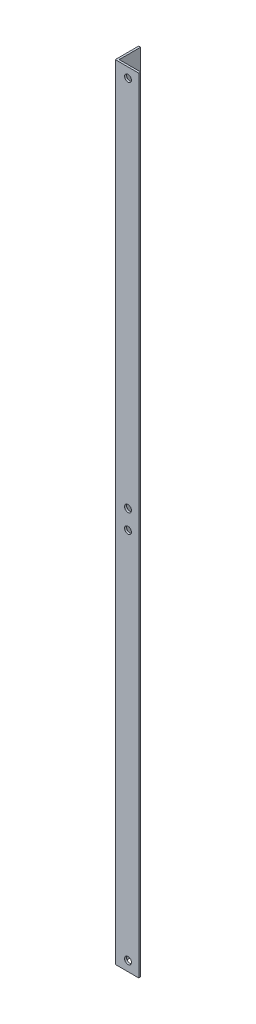
ISO-10303-21;
HEADER;
FILE_DESCRIPTION(('STEP AP214'),'2;1');
FILE_NAME('part.step','',(''),(''),'','','');
FILE_SCHEMA(('AUTOMOTIVE_DESIGN { 1 0 10303 214 1 1 1 1 }'));
ENDSEC;
DATA;
#1=APPLICATION_CONTEXT('core data for automotive mechanical design processes');
#2=APPLICATION_PROTOCOL_DEFINITION('international standard','automotive_design',2000,#1);
#3=PRODUCT_CONTEXT('',#1,'mechanical');
#4=PRODUCT('Part','Part','',(#3));
#5=PRODUCT_RELATED_PRODUCT_CATEGORY('part','',(#4));
#6=PRODUCT_DEFINITION_FORMATION('','',#4);
#7=PRODUCT_DEFINITION_CONTEXT('part definition',#1,'design');
#8=PRODUCT_DEFINITION('design','',#6,#7);
#9=PRODUCT_DEFINITION_SHAPE('','',#8);
#10=(LENGTH_UNIT() NAMED_UNIT(*) SI_UNIT(.MILLI.,.METRE.));
#11=(NAMED_UNIT(*) PLANE_ANGLE_UNIT() SI_UNIT($,.RADIAN.));
#12=(NAMED_UNIT(*) SI_UNIT($,.STERADIAN.) SOLID_ANGLE_UNIT());
#13=UNCERTAINTY_MEASURE_WITH_UNIT(LENGTH_MEASURE(1.E-05),#10,'distance_accuracy_value','');
#14=(GEOMETRIC_REPRESENTATION_CONTEXT(3) GLOBAL_UNCERTAINTY_ASSIGNED_CONTEXT((#13)) GLOBAL_UNIT_ASSIGNED_CONTEXT((#10,
#11,#12)) REPRESENTATION_CONTEXT('',''));
#15=CARTESIAN_POINT('',(0.,0.,0.));
#16=DIRECTION('',(0.,0.,1.));
#17=DIRECTION('',(1.,0.,0.));
#18=AXIS2_PLACEMENT_3D('',#15,#16,#17);
#19=CARTESIAN_POINT('',(0.,635.,0.));
#20=DIRECTION('',(1.,0.,0.));
#21=DIRECTION('',(0.,0.,-1.));
#22=AXIS2_PLACEMENT_3D('',#19,#20,#21);
#23=PLANE('',#22);
#24=DIRECTION('',(0.,0.,1.));
#25=VECTOR('',#24,1.);
#26=CARTESIAN_POINT('',(0.,-635.,0.));
#27=LINE('',#26,#25);
#28=CARTESIAN_POINT('',(0.,-635.,-38.1));
#29=VERTEX_POINT('',#28);
#30=CARTESIAN_POINT('',(0.,-635.,0.));
#31=VERTEX_POINT('',#30);
#32=EDGE_CURVE('E117',#29,#31,#27,.T.);
#33=ORIENTED_EDGE('',*,*,#32,.T.);
#34=DIRECTION('',(0.,-1.,0.));
#35=VECTOR('',#34,1.);
#36=CARTESIAN_POINT('',(0.,635.,0.));
#37=LINE('',#36,#35);
#38=CARTESIAN_POINT('',(0.,635.,0.));
#39=VERTEX_POINT('',#38);
#40=EDGE_CURVE('E11',#39,#31,#37,.T.);
#41=ORIENTED_EDGE('',*,*,#40,.F.);
#42=DIRECTION('',(0.,0.,1.));
#43=VECTOR('',#42,1.);
#44=CARTESIAN_POINT('',(0.,635.,0.));
#45=LINE('',#44,#43);
#46=CARTESIAN_POINT('',(0.,635.,-38.1));
#47=VERTEX_POINT('',#46);
#48=EDGE_CURVE('E128',#47,#39,#45,.T.);
#49=ORIENTED_EDGE('',*,*,#48,.F.);
#50=DIRECTION('',(0.,-1.,0.));
#51=VECTOR('',#50,1.);
#52=CARTESIAN_POINT('',(0.,635.,-38.1));
#53=LINE('',#52,#51);
#54=EDGE_CURVE('E113',#47,#29,#53,.T.);
#55=ORIENTED_EDGE('',*,*,#54,.T.);
#56=EDGE_LOOP('',(#33,#41,#49,#55));
#57=FACE_BOUND('',#56,.T.);
#58=ADVANCED_FACE('F33',(#57),#23,.F.);
#59=CARTESIAN_POINT('',(0.,635.,0.));
#60=DIRECTION('',(0.,0.,-1.));
#61=DIRECTION('',(-1.,0.,0.));
#62=AXIS2_PLACEMENT_3D('',#59,#60,#61);
#63=PLANE('',#62);
#64=CARTESIAN_POINT('',(20.6375,-619.125,0.));
#65=DIRECTION('',(0.,0.,1.));
#66=DIRECTION('',(-1.,0.,0.));
#67=AXIS2_PLACEMENT_3D('',#64,#65,#66);
#68=CIRCLE('',#67,5.58799999999991);
#69=CARTESIAN_POINT('',(15.0495000000001,-619.125,0.));
#70=VERTEX_POINT('',#69);
#71=EDGE_CURVE('E185',#70,#70,#68,.T.);
#72=ORIENTED_EDGE('',*,*,#71,.F.);
#73=EDGE_LOOP('',(#72));
#74=FACE_BOUND('',#73,.T.);
#75=CARTESIAN_POINT('',(20.6375,-15.24,0.));
#76=DIRECTION('',(0.,0.,1.));
#77=DIRECTION('',(-1.,0.,0.));
#78=AXIS2_PLACEMENT_3D('',#75,#76,#77);
#79=CIRCLE('',#78,5.58799999999994);
#80=CARTESIAN_POINT('',(15.0495000000001,-15.24,0.));
#81=VERTEX_POINT('',#80);
#82=EDGE_CURVE('E198',#81,#81,#79,.T.);
#83=ORIENTED_EDGE('',*,*,#82,.F.);
#84=EDGE_LOOP('',(#83));
#85=FACE_BOUND('',#84,.T.);
#86=CARTESIAN_POINT('',(20.6375,619.125,0.));
#87=DIRECTION('',(0.,0.,-1.));
#88=DIRECTION('',(-1.,0.,0.));
#89=AXIS2_PLACEMENT_3D('',#86,#87,#88);
#90=CIRCLE('',#89,5.58799999999991);
#91=CARTESIAN_POINT('',(15.0495000000001,619.125,0.));
#92=VERTEX_POINT('',#91);
#93=EDGE_CURVE('E121',#92,#92,#90,.T.);
#94=ORIENTED_EDGE('',*,*,#93,.T.);
#95=EDGE_LOOP('',(#94));
#96=FACE_BOUND('',#95,.T.);
#97=CARTESIAN_POINT('',(20.6375,15.24,0.));
#98=DIRECTION('',(0.,0.,-1.));
#99=DIRECTION('',(-1.,0.,0.));
#100=AXIS2_PLACEMENT_3D('',#97,#98,#99);
#101=CIRCLE('',#100,5.58799999999994);
#102=CARTESIAN_POINT('',(15.0495000000001,15.24,0.));
#103=VERTEX_POINT('',#102);
#104=EDGE_CURVE('E184',#103,#103,#101,.T.);
#105=ORIENTED_EDGE('',*,*,#104,.T.);
#106=EDGE_LOOP('',(#105));
#107=FACE_BOUND('',#106,.T.);
#108=DIRECTION('',(1.,0.,0.));
#109=VECTOR('',#108,1.);
#110=CARTESIAN_POINT('',(0.,-635.,0.));
#111=LINE('',#110,#109);
#112=CARTESIAN_POINT('',(38.1,-635.,0.));
#113=VERTEX_POINT('',#112);
#114=EDGE_CURVE('E120',#31,#113,#111,.T.);
#115=ORIENTED_EDGE('',*,*,#114,.T.);
#116=DIRECTION('',(0.,-1.,0.));
#117=VECTOR('',#116,1.);
#118=CARTESIAN_POINT('',(38.1,635.,0.));
#119=LINE('',#118,#117);
#120=CARTESIAN_POINT('',(38.1,635.,0.));
#121=VERTEX_POINT('',#120);
#122=EDGE_CURVE('E41',#121,#113,#119,.T.);
#123=ORIENTED_EDGE('',*,*,#122,.F.);
#124=DIRECTION('',(1.,0.,0.));
#125=VECTOR('',#124,1.);
#126=CARTESIAN_POINT('',(0.,635.,0.));
#127=LINE('',#126,#125);
#128=EDGE_CURVE('E86',#39,#121,#127,.T.);
#129=ORIENTED_EDGE('',*,*,#128,.F.);
#130=ORIENTED_EDGE('',*,*,#40,.T.);
#131=EDGE_LOOP('',(#115,#123,#129,#130));
#132=FACE_BOUND('',#131,.T.);
#133=ADVANCED_FACE('F152',(#74,#85,#96,#107,#132),#63,.F.);
#134=CARTESIAN_POINT('',(38.1,635.,0.));
#135=DIRECTION('',(-1.,0.,0.));
#136=DIRECTION('',(0.,0.,1.));
#137=AXIS2_PLACEMENT_3D('',#134,#135,#136);
#138=PLANE('',#137);
#139=DIRECTION('',(0.,0.,-1.));
#140=VECTOR('',#139,1.);
#141=CARTESIAN_POINT('',(38.1,-635.,0.));
#142=LINE('',#141,#140);
#143=CARTESIAN_POINT('',(38.1,-635.,-3.175));
#144=VERTEX_POINT('',#143);
#145=EDGE_CURVE('E123',#113,#144,#142,.T.);
#146=ORIENTED_EDGE('',*,*,#145,.T.);
#147=DIRECTION('',(0.,-1.,0.));
#148=VECTOR('',#147,1.);
#149=CARTESIAN_POINT('',(38.1,635.,-3.175));
#150=LINE('',#149,#148);
#151=CARTESIAN_POINT('',(38.1,635.,-3.175));
#152=VERTEX_POINT('',#151);
#153=EDGE_CURVE('E108',#152,#144,#150,.T.);
#154=ORIENTED_EDGE('',*,*,#153,.F.);
#155=DIRECTION('',(0.,0.,-1.));
#156=VECTOR('',#155,1.);
#157=CARTESIAN_POINT('',(38.1,635.,0.));
#158=LINE('',#157,#156);
#159=EDGE_CURVE('E99',#121,#152,#158,.T.);
#160=ORIENTED_EDGE('',*,*,#159,.F.);
#161=ORIENTED_EDGE('',*,*,#122,.T.);
#162=EDGE_LOOP('',(#146,#154,#160,#161));
#163=FACE_BOUND('',#162,.T.);
#164=ADVANCED_FACE('F134',(#163),#138,.F.);
#165=CARTESIAN_POINT('',(3.17500000000001,635.,-3.175));
#166=DIRECTION('',(0.,0.,1.));
#167=DIRECTION('',(1.,0.,0.));
#168=AXIS2_PLACEMENT_3D('',#165,#166,#167);
#169=PLANE('',#168);
#170=CARTESIAN_POINT('',(20.6375,-619.125,-3.175));
#171=DIRECTION('',(0.,0.,1.));
#172=DIRECTION('',(-1.,0.,0.));
#173=AXIS2_PLACEMENT_3D('',#170,#171,#172);
#174=CIRCLE('',#173,5.58799999999991);
#175=CARTESIAN_POINT('',(15.0495000000001,-619.125,-3.175));
#176=VERTEX_POINT('',#175);
#177=EDGE_CURVE('E171',#176,#176,#174,.T.);
#178=ORIENTED_EDGE('',*,*,#177,.T.);
#179=EDGE_LOOP('',(#178));
#180=FACE_BOUND('',#179,.T.);
#181=CARTESIAN_POINT('',(20.6375,-15.24,-3.175));
#182=DIRECTION('',(0.,0.,1.));
#183=DIRECTION('',(-1.,0.,0.));
#184=AXIS2_PLACEMENT_3D('',#181,#182,#183);
#185=CIRCLE('',#184,5.58799999999994);
#186=CARTESIAN_POINT('',(15.0495000000001,-15.24,-3.175));
#187=VERTEX_POINT('',#186);
#188=EDGE_CURVE('E175',#187,#187,#185,.T.);
#189=ORIENTED_EDGE('',*,*,#188,.T.);
#190=EDGE_LOOP('',(#189));
#191=FACE_BOUND('',#190,.T.);
#192=CARTESIAN_POINT('',(20.6375,619.125,-3.175));
#193=DIRECTION('',(0.,0.,-1.));
#194=DIRECTION('',(-1.,0.,0.));
#195=AXIS2_PLACEMENT_3D('',#192,#193,#194);
#196=CIRCLE('',#195,5.58799999999991);
#197=CARTESIAN_POINT('',(15.0495000000001,619.125,-3.175));
#198=VERTEX_POINT('',#197);
#199=EDGE_CURVE('E179',#198,#198,#196,.T.);
#200=ORIENTED_EDGE('',*,*,#199,.F.);
#201=EDGE_LOOP('',(#200));
#202=FACE_BOUND('',#201,.T.);
#203=CARTESIAN_POINT('',(20.6375,15.24,-3.175));
#204=DIRECTION('',(0.,0.,-1.));
#205=DIRECTION('',(-1.,0.,0.));
#206=AXIS2_PLACEMENT_3D('',#203,#204,#205);
#207=CIRCLE('',#206,5.58799999999994);
#208=CARTESIAN_POINT('',(15.0495000000001,15.24,-3.175));
#209=VERTEX_POINT('',#208);
#210=EDGE_CURVE('E182',#209,#209,#207,.T.);
#211=ORIENTED_EDGE('',*,*,#210,.F.);
#212=EDGE_LOOP('',(#211));
#213=FACE_BOUND('',#212,.T.);
#214=DIRECTION('',(-1.,0.,0.));
#215=VECTOR('',#214,1.);
#216=CARTESIAN_POINT('',(3.17500000000001,-635.,-3.175));
#217=LINE('',#216,#215);
#218=CARTESIAN_POINT('',(3.17500000000001,-635.,-3.175));
#219=VERTEX_POINT('',#218);
#220=EDGE_CURVE('E107',#144,#219,#217,.T.);
#221=ORIENTED_EDGE('',*,*,#220,.T.);
#222=DIRECTION('',(0.,-1.,0.));
#223=VECTOR('',#222,1.);
#224=CARTESIAN_POINT('',(3.17500000000001,635.,-3.175));
#225=LINE('',#224,#223);
#226=CARTESIAN_POINT('',(3.17500000000001,635.,-3.175));
#227=VERTEX_POINT('',#226);
#228=EDGE_CURVE('E104',#227,#219,#225,.T.);
#229=ORIENTED_EDGE('',*,*,#228,.F.);
#230=DIRECTION('',(-1.,0.,0.));
#231=VECTOR('',#230,1.);
#232=CARTESIAN_POINT('',(3.17500000000001,635.,-3.175));
#233=LINE('',#232,#231);
#234=EDGE_CURVE('E93',#152,#227,#233,.T.);
#235=ORIENTED_EDGE('',*,*,#234,.F.);
#236=ORIENTED_EDGE('',*,*,#153,.T.);
#237=EDGE_LOOP('',(#221,#229,#235,#236));
#238=FACE_BOUND('',#237,.T.);
#239=ADVANCED_FACE('F105',(#180,#191,#202,#213,#238),#169,.F.);
#240=CARTESIAN_POINT('',(3.17500000000001,635.,-38.1));
#241=DIRECTION('',(-1.,0.,0.));
#242=DIRECTION('',(0.,0.,1.));
#243=AXIS2_PLACEMENT_3D('',#240,#241,#242);
#244=PLANE('',#243);
#245=DIRECTION('',(0.,0.,-1.));
#246=VECTOR('',#245,1.);
#247=CARTESIAN_POINT('',(3.17500000000001,-635.,-38.1));
#248=LINE('',#247,#246);
#249=CARTESIAN_POINT('',(3.17500000000001,-635.,-38.1));
#250=VERTEX_POINT('',#249);
#251=EDGE_CURVE('E72',#219,#250,#248,.T.);
#252=ORIENTED_EDGE('',*,*,#251,.T.);
#253=DIRECTION('',(0.,-1.,0.));
#254=VECTOR('',#253,1.);
#255=CARTESIAN_POINT('',(3.17500000000001,635.,-38.1));
#256=LINE('',#255,#254);
#257=CARTESIAN_POINT('',(3.17500000000001,635.,-38.1));
#258=VERTEX_POINT('',#257);
#259=EDGE_CURVE('E109',#258,#250,#256,.T.);
#260=ORIENTED_EDGE('',*,*,#259,.F.);
#261=DIRECTION('',(0.,0.,-1.));
#262=VECTOR('',#261,1.);
#263=CARTESIAN_POINT('',(3.17500000000001,635.,-38.1));
#264=LINE('',#263,#262);
#265=EDGE_CURVE('E97',#227,#258,#264,.T.);
#266=ORIENTED_EDGE('',*,*,#265,.F.);
#267=ORIENTED_EDGE('',*,*,#228,.T.);
#268=EDGE_LOOP('',(#252,#260,#266,#267));
#269=FACE_BOUND('',#268,.T.);
#270=ADVANCED_FACE('F111',(#269),#244,.F.);
#271=CARTESIAN_POINT('',(0.,635.,-38.1));
#272=DIRECTION('',(0.,0.,1.));
#273=DIRECTION('',(1.,0.,0.));
#274=AXIS2_PLACEMENT_3D('',#271,#272,#273);
#275=PLANE('',#274);
#276=DIRECTION('',(-1.,0.,0.));
#277=VECTOR('',#276,1.);
#278=CARTESIAN_POINT('',(0.,-635.,-38.1));
#279=LINE('',#278,#277);
#280=EDGE_CURVE('E78',#250,#29,#279,.T.);
#281=ORIENTED_EDGE('',*,*,#280,.T.);
#282=ORIENTED_EDGE('',*,*,#54,.F.);
#283=DIRECTION('',(-1.,0.,0.));
#284=VECTOR('',#283,1.);
#285=CARTESIAN_POINT('',(0.,635.,-38.1));
#286=LINE('',#285,#284);
#287=EDGE_CURVE('E49',#258,#47,#286,.T.);
#288=ORIENTED_EDGE('',*,*,#287,.F.);
#289=ORIENTED_EDGE('',*,*,#259,.T.);
#290=EDGE_LOOP('',(#281,#282,#288,#289));
#291=FACE_BOUND('',#290,.T.);
#292=ADVANCED_FACE('F141',(#291),#275,.F.);
#293=CARTESIAN_POINT('',(0.,635.,0.));
#294=DIRECTION('',(0.,-1.,0.));
#295=DIRECTION('',(0.,0.,-1.));
#296=AXIS2_PLACEMENT_3D('',#293,#294,#295);
#297=PLANE('',#296);
#298=ORIENTED_EDGE('',*,*,#48,.T.);
#299=ORIENTED_EDGE('',*,*,#128,.T.);
#300=ORIENTED_EDGE('',*,*,#159,.T.);
#301=ORIENTED_EDGE('',*,*,#234,.T.);
#302=ORIENTED_EDGE('',*,*,#265,.T.);
#303=ORIENTED_EDGE('',*,*,#287,.T.);
#304=EDGE_LOOP('',(#298,#299,#300,#301,#302,#303));
#305=FACE_BOUND('',#304,.T.);
#306=ADVANCED_FACE('F95',(#305),#297,.F.);
#307=CARTESIAN_POINT('',(0.,-635.,0.));
#308=DIRECTION('',(0.,-1.,0.));
#309=DIRECTION('',(0.,0.,-1.));
#310=AXIS2_PLACEMENT_3D('',#307,#308,#309);
#311=PLANE('',#310);
#312=ORIENTED_EDGE('',*,*,#32,.F.);
#313=ORIENTED_EDGE('',*,*,#280,.F.);
#314=ORIENTED_EDGE('',*,*,#251,.F.);
#315=ORIENTED_EDGE('',*,*,#220,.F.);
#316=ORIENTED_EDGE('',*,*,#145,.F.);
#317=ORIENTED_EDGE('',*,*,#114,.F.);
#318=EDGE_LOOP('',(#312,#313,#314,#315,#316,#317));
#319=FACE_BOUND('',#318,.T.);
#320=ADVANCED_FACE('F137',(#319),#311,.T.);
#321=CARTESIAN_POINT('',(20.6375,15.24,0.));
#322=DIRECTION('',(0.,0.,-1.));
#323=DIRECTION('',(-1.,0.,0.));
#324=AXIS2_PLACEMENT_3D('',#321,#322,#323);
#325=CYLINDRICAL_SURFACE('',#324,5.58799999999994);
#326=ORIENTED_EDGE('',*,*,#104,.F.);
#327=EDGE_LOOP('',(#326));
#328=FACE_BOUND('',#327,.T.);
#329=ORIENTED_EDGE('',*,*,#210,.T.);
#330=EDGE_LOOP('',(#329));
#331=FACE_BOUND('',#330,.T.);
#332=ADVANCED_FACE('F210',(#328,#331),#325,.F.);
#333=CARTESIAN_POINT('',(20.6375,619.125,0.));
#334=DIRECTION('',(0.,0.,-1.));
#335=DIRECTION('',(-1.,0.,0.));
#336=AXIS2_PLACEMENT_3D('',#333,#334,#335);
#337=CYLINDRICAL_SURFACE('',#336,5.58799999999991);
#338=ORIENTED_EDGE('',*,*,#93,.F.);
#339=EDGE_LOOP('',(#338));
#340=FACE_BOUND('',#339,.T.);
#341=ORIENTED_EDGE('',*,*,#199,.T.);
#342=EDGE_LOOP('',(#341));
#343=FACE_BOUND('',#342,.T.);
#344=ADVANCED_FACE('F212',(#340,#343),#337,.F.);
#345=CARTESIAN_POINT('',(20.6375,-15.24,0.));
#346=DIRECTION('',(0.,0.,-1.));
#347=DIRECTION('',(-1.,0.,0.));
#348=AXIS2_PLACEMENT_3D('',#345,#346,#347);
#349=CYLINDRICAL_SURFACE('',#348,5.58799999999994);
#350=CARTESIAN_POINT('',(15.0495000000001,-15.24,0.));
#351=CARTESIAN_POINT('',(15.0495000000001,-15.24,-0.0330729166666657));
#352=CARTESIAN_POINT('',(15.0495000000001,-15.24,-0.0661458333333324));
#353=CARTESIAN_POINT('',(15.0495000000001,-15.24,-0.132291666666666));
#354=CARTESIAN_POINT('',(15.0495000000001,-15.24,-0.165364583333332));
#355=CARTESIAN_POINT('',(15.0495000000001,-15.24,-0.231510416666666));
#356=CARTESIAN_POINT('',(15.0495000000001,-15.24,-0.264583333333332));
#357=CARTESIAN_POINT('',(15.0495000000001,-15.24,-0.330729166666666));
#358=CARTESIAN_POINT('',(15.0495000000001,-15.24,-0.363802083333332));
#359=CARTESIAN_POINT('',(15.0495000000001,-15.24,-0.429947916666666));
#360=CARTESIAN_POINT('',(15.0495000000001,-15.24,-0.463020833333332));
#361=CARTESIAN_POINT('',(15.0495000000001,-15.24,-0.529166666666666));
#362=CARTESIAN_POINT('',(15.0495000000001,-15.24,-0.562239583333332));
#363=CARTESIAN_POINT('',(15.0495000000001,-15.24,-0.628385416666666));
#364=CARTESIAN_POINT('',(15.0495000000001,-15.24,-0.661458333333332));
#365=CARTESIAN_POINT('',(15.0495000000001,-15.24,-0.727604166666666));
#366=CARTESIAN_POINT('',(15.0495000000001,-15.24,-0.760677083333332));
#367=CARTESIAN_POINT('',(15.0495000000001,-15.24,-0.826822916666666));
#368=CARTESIAN_POINT('',(15.0495000000001,-15.24,-0.859895833333332));
#369=CARTESIAN_POINT('',(15.0495000000001,-15.24,-0.926041666666666));
#370=CARTESIAN_POINT('',(15.0495000000001,-15.24,-0.959114583333332));
#371=CARTESIAN_POINT('',(15.0495000000001,-15.24,-1.02526041666667));
#372=CARTESIAN_POINT('',(15.0495000000001,-15.24,-1.05833333333333));
#373=CARTESIAN_POINT('',(15.0495000000001,-15.24,-1.12447916666667));
#374=CARTESIAN_POINT('',(15.0495000000001,-15.24,-1.15755208333333));
#375=CARTESIAN_POINT('',(15.0495000000001,-15.24,-1.22369791666667));
#376=CARTESIAN_POINT('',(15.0495000000001,-15.24,-1.25677083333333));
#377=CARTESIAN_POINT('',(15.0495000000001,-15.24,-1.32291666666667));
#378=CARTESIAN_POINT('',(15.0495000000001,-15.24,-1.35598958333333));
#379=CARTESIAN_POINT('',(15.0495000000001,-15.24,-1.42213541666667));
#380=CARTESIAN_POINT('',(15.0495000000001,-15.24,-1.45520833333333));
#381=CARTESIAN_POINT('',(15.0495000000001,-15.24,-1.52135416666667));
#382=CARTESIAN_POINT('',(15.0495000000001,-15.24,-1.55442708333333));
#383=CARTESIAN_POINT('',(15.0495000000001,-15.24,-1.62057291666667));
#384=CARTESIAN_POINT('',(15.0495000000001,-15.24,-1.65364583333333));
#385=CARTESIAN_POINT('',(15.0495000000001,-15.24,-1.71979166666667));
#386=CARTESIAN_POINT('',(15.0495000000001,-15.24,-1.75286458333333));
#387=CARTESIAN_POINT('',(15.0495000000001,-15.24,-1.81901041666667));
#388=CARTESIAN_POINT('',(15.0495000000001,-15.24,-1.85208333333333));
#389=CARTESIAN_POINT('',(15.0495000000001,-15.24,-1.91822916666667));
#390=CARTESIAN_POINT('',(15.0495000000001,-15.24,-1.95130208333333));
#391=CARTESIAN_POINT('',(15.0495000000001,-15.24,-2.01744791666667));
#392=CARTESIAN_POINT('',(15.0495000000001,-15.24,-2.05052083333333));
#393=CARTESIAN_POINT('',(15.0495000000001,-15.24,-2.11666666666667));
#394=CARTESIAN_POINT('',(15.0495000000001,-15.24,-2.14973958333333));
#395=CARTESIAN_POINT('',(15.0495000000001,-15.24,-2.21588541666667));
#396=CARTESIAN_POINT('',(15.0495000000001,-15.24,-2.24895833333333));
#397=CARTESIAN_POINT('',(15.0495000000001,-15.24,-2.31510416666667));
#398=CARTESIAN_POINT('',(15.0495000000001,-15.24,-2.34817708333333));
#399=CARTESIAN_POINT('',(15.0495000000001,-15.24,-2.41432291666667));
#400=CARTESIAN_POINT('',(15.0495000000001,-15.24,-2.44739583333333));
#401=CARTESIAN_POINT('',(15.0495000000001,-15.24,-2.51354166666667));
#402=CARTESIAN_POINT('',(15.0495000000001,-15.24,-2.54661458333333));
#403=CARTESIAN_POINT('',(15.0495000000001,-15.24,-2.61276041666667));
#404=CARTESIAN_POINT('',(15.0495000000001,-15.24,-2.64583333333333));
#405=CARTESIAN_POINT('',(15.0495000000001,-15.24,-2.71197916666667));
#406=CARTESIAN_POINT('',(15.0495000000001,-15.24,-2.74505208333333));
#407=CARTESIAN_POINT('',(15.0495000000001,-15.24,-2.81119791666667));
#408=CARTESIAN_POINT('',(15.0495000000001,-15.24,-2.84427083333333));
#409=CARTESIAN_POINT('',(15.0495000000001,-15.24,-2.91041666666667));
#410=CARTESIAN_POINT('',(15.0495000000001,-15.24,-2.94348958333333));
#411=CARTESIAN_POINT('',(15.0495000000001,-15.24,-3.00963541666667));
#412=CARTESIAN_POINT('',(15.0495000000001,-15.24,-3.04270833333333));
#413=CARTESIAN_POINT('',(15.0495000000001,-15.24,-3.10885416666667));
#414=CARTESIAN_POINT('',(15.0495000000001,-15.24,-3.14192708333333));
#415=CARTESIAN_POINT('',(15.0495000000001,-15.24,-3.175));
#416=B_SPLINE_CURVE_WITH_KNOTS('',3,(#350,#351,#352,#353,#354,#355,#356,#357,#358,#359,#360,
#361,#362,#363,#364,#365,#366,#367,#368,#369,#370,#371,#372,#373,#374,#375,#376,#377,#378,#379,
#380,#381,#382,#383,#384,#385,#386,#387,#388,#389,#390,#391,#392,#393,#394,#395,#396,#397,#398,
#399,#400,#401,#402,#403,#404,#405,#406,#407,#408,#409,#410,#411,#412,#413,#414,#415),
.UNSPECIFIED.,.F.,.F.,(4,2,2,2,2,2,2,2,2,2,2,2,2,2,2,2,2,2,2,2,2,2,2,2,2,2,2,2,2,2,2,2,4),(0.,
0.09921875,0.1984375,0.29765625,0.396875,0.49609375,0.5953125,0.69453125,0.79375,0.89296875,
0.9921875,1.09140625,1.190625,1.28984375,1.3890625,1.48828125,1.5875,1.68671875,1.7859375,
1.88515625,1.984375,2.08359375,2.1828125,2.28203125,2.38125,2.48046875,2.5796875,2.67890625,
2.778125,2.87734375,2.9765625,3.07578125,3.175),.UNSPECIFIED.);
#417=EDGE_CURVE('BSEAM203',#81,#187,#416,.T.);
#418=ORIENTED_EDGE('',*,*,#82,.T.);
#419=ORIENTED_EDGE('',*,*,#188,.F.);
#420=ORIENTED_EDGE('',*,*,#417,.T.);
#421=ORIENTED_EDGE('',*,*,#417,.F.);
#422=EDGE_LOOP('',(#418,#420,#419,#421));
#423=FACE_BOUND('',#422,.T.);
#424=ADVANCED_FACE('F203',(#423),#349,.F.);
#425=CARTESIAN_POINT('',(20.6375,-619.125,0.));
#426=DIRECTION('',(0.,0.,-1.));
#427=DIRECTION('',(-1.,0.,0.));
#428=AXIS2_PLACEMENT_3D('',#425,#426,#427);
#429=CYLINDRICAL_SURFACE('',#428,5.58799999999991);
#430=CARTESIAN_POINT('',(15.0495000000001,-619.125,0.));
#431=CARTESIAN_POINT('',(15.0495000000001,-619.125,-0.0330729166666657));
#432=CARTESIAN_POINT('',(15.0495000000001,-619.125,-0.0661458333333324));
#433=CARTESIAN_POINT('',(15.0495000000001,-619.125,-0.132291666666666));
#434=CARTESIAN_POINT('',(15.0495000000001,-619.125,-0.165364583333332));
#435=CARTESIAN_POINT('',(15.0495000000001,-619.125,-0.231510416666666));
#436=CARTESIAN_POINT('',(15.0495000000001,-619.125,-0.264583333333332));
#437=CARTESIAN_POINT('',(15.0495000000001,-619.125,-0.330729166666666));
#438=CARTESIAN_POINT('',(15.0495000000001,-619.125,-0.363802083333332));
#439=CARTESIAN_POINT('',(15.0495000000001,-619.125,-0.429947916666666));
#440=CARTESIAN_POINT('',(15.0495000000001,-619.125,-0.463020833333332));
#441=CARTESIAN_POINT('',(15.0495000000001,-619.125,-0.529166666666666));
#442=CARTESIAN_POINT('',(15.0495000000001,-619.125,-0.562239583333332));
#443=CARTESIAN_POINT('',(15.0495000000001,-619.125,-0.628385416666666));
#444=CARTESIAN_POINT('',(15.0495000000001,-619.125,-0.661458333333332));
#445=CARTESIAN_POINT('',(15.0495000000001,-619.125,-0.727604166666666));
#446=CARTESIAN_POINT('',(15.0495000000001,-619.125,-0.760677083333332));
#447=CARTESIAN_POINT('',(15.0495000000001,-619.125,-0.826822916666666));
#448=CARTESIAN_POINT('',(15.0495000000001,-619.125,-0.859895833333332));
#449=CARTESIAN_POINT('',(15.0495000000001,-619.125,-0.926041666666666));
#450=CARTESIAN_POINT('',(15.0495000000001,-619.125,-0.959114583333332));
#451=CARTESIAN_POINT('',(15.0495000000001,-619.125,-1.02526041666667));
#452=CARTESIAN_POINT('',(15.0495000000001,-619.125,-1.05833333333333));
#453=CARTESIAN_POINT('',(15.0495000000001,-619.125,-1.12447916666667));
#454=CARTESIAN_POINT('',(15.0495000000001,-619.125,-1.15755208333333));
#455=CARTESIAN_POINT('',(15.0495000000001,-619.125,-1.22369791666667));
#456=CARTESIAN_POINT('',(15.0495000000001,-619.125,-1.25677083333333));
#457=CARTESIAN_POINT('',(15.0495000000001,-619.125,-1.32291666666667));
#458=CARTESIAN_POINT('',(15.0495000000001,-619.125,-1.35598958333333));
#459=CARTESIAN_POINT('',(15.0495000000001,-619.125,-1.42213541666667));
#460=CARTESIAN_POINT('',(15.0495000000001,-619.125,-1.45520833333333));
#461=CARTESIAN_POINT('',(15.0495000000001,-619.125,-1.52135416666667));
#462=CARTESIAN_POINT('',(15.0495000000001,-619.125,-1.55442708333333));
#463=CARTESIAN_POINT('',(15.0495000000001,-619.125,-1.62057291666667));
#464=CARTESIAN_POINT('',(15.0495000000001,-619.125,-1.65364583333333));
#465=CARTESIAN_POINT('',(15.0495000000001,-619.125,-1.71979166666667));
#466=CARTESIAN_POINT('',(15.0495000000001,-619.125,-1.75286458333333));
#467=CARTESIAN_POINT('',(15.0495000000001,-619.125,-1.81901041666667));
#468=CARTESIAN_POINT('',(15.0495000000001,-619.125,-1.85208333333333));
#469=CARTESIAN_POINT('',(15.0495000000001,-619.125,-1.91822916666667));
#470=CARTESIAN_POINT('',(15.0495000000001,-619.125,-1.95130208333333));
#471=CARTESIAN_POINT('',(15.0495000000001,-619.125,-2.01744791666667));
#472=CARTESIAN_POINT('',(15.0495000000001,-619.125,-2.05052083333333));
#473=CARTESIAN_POINT('',(15.0495000000001,-619.125,-2.11666666666667));
#474=CARTESIAN_POINT('',(15.0495000000001,-619.125,-2.14973958333333));
#475=CARTESIAN_POINT('',(15.0495000000001,-619.125,-2.21588541666667));
#476=CARTESIAN_POINT('',(15.0495000000001,-619.125,-2.24895833333333));
#477=CARTESIAN_POINT('',(15.0495000000001,-619.125,-2.31510416666667));
#478=CARTESIAN_POINT('',(15.0495000000001,-619.125,-2.34817708333333));
#479=CARTESIAN_POINT('',(15.0495000000001,-619.125,-2.41432291666667));
#480=CARTESIAN_POINT('',(15.0495000000001,-619.125,-2.44739583333333));
#481=CARTESIAN_POINT('',(15.0495000000001,-619.125,-2.51354166666667));
#482=CARTESIAN_POINT('',(15.0495000000001,-619.125,-2.54661458333333));
#483=CARTESIAN_POINT('',(15.0495000000001,-619.125,-2.61276041666667));
#484=CARTESIAN_POINT('',(15.0495000000001,-619.125,-2.64583333333333));
#485=CARTESIAN_POINT('',(15.0495000000001,-619.125,-2.71197916666667));
#486=CARTESIAN_POINT('',(15.0495000000001,-619.125,-2.74505208333333));
#487=CARTESIAN_POINT('',(15.0495000000001,-619.125,-2.81119791666667));
#488=CARTESIAN_POINT('',(15.0495000000001,-619.125,-2.84427083333333));
#489=CARTESIAN_POINT('',(15.0495000000001,-619.125,-2.91041666666667));
#490=CARTESIAN_POINT('',(15.0495000000001,-619.125,-2.94348958333333));
#491=CARTESIAN_POINT('',(15.0495000000001,-619.125,-3.00963541666667));
#492=CARTESIAN_POINT('',(15.0495000000001,-619.125,-3.04270833333333));
#493=CARTESIAN_POINT('',(15.0495000000001,-619.125,-3.10885416666667));
#494=CARTESIAN_POINT('',(15.0495000000001,-619.125,-3.14192708333333));
#495=CARTESIAN_POINT('',(15.0495000000001,-619.125,-3.175));
#496=B_SPLINE_CURVE_WITH_KNOTS('',3,(#430,#431,#432,#433,#434,#435,#436,#437,#438,#439,#440,
#441,#442,#443,#444,#445,#446,#447,#448,#449,#450,#451,#452,#453,#454,#455,#456,#457,#458,#459,
#460,#461,#462,#463,#464,#465,#466,#467,#468,#469,#470,#471,#472,#473,#474,#475,#476,#477,#478,
#479,#480,#481,#482,#483,#484,#485,#486,#487,#488,#489,#490,#491,#492,#493,#494,#495),
.UNSPECIFIED.,.F.,.F.,(4,2,2,2,2,2,2,2,2,2,2,2,2,2,2,2,2,2,2,2,2,2,2,2,2,2,2,2,2,2,2,2,4),(0.,
0.09921875,0.1984375,0.29765625,0.396875,0.49609375,0.5953125,0.69453125,0.79375,0.89296875,
0.9921875,1.09140625,1.190625,1.28984375,1.3890625,1.48828125,1.5875,1.68671875,1.7859375,
1.88515625,1.984375,2.08359375,2.1828125,2.28203125,2.38125,2.48046875,2.5796875,2.67890625,
2.778125,2.87734375,2.9765625,3.07578125,3.175),.UNSPECIFIED.);
#497=EDGE_CURVE('BSEAM223',#70,#176,#496,.T.);
#498=ORIENTED_EDGE('',*,*,#71,.T.);
#499=ORIENTED_EDGE('',*,*,#177,.F.);
#500=ORIENTED_EDGE('',*,*,#497,.T.);
#501=ORIENTED_EDGE('',*,*,#497,.F.);
#502=EDGE_LOOP('',(#498,#500,#499,#501));
#503=FACE_BOUND('',#502,.T.);
#504=ADVANCED_FACE('F223',(#503),#429,.F.);
#505=CLOSED_SHELL('',(#58,#133,#164,#239,#270,#292,#306,#320,#332,#344,#424,#504));
#506=MANIFOLD_SOLID_BREP('B2',#505);
#507=ADVANCED_BREP_SHAPE_REPRESENTATION('',(#18,#506),#14);
#508=SHAPE_DEFINITION_REPRESENTATION(#9,#507);
ENDSEC;
END-ISO-10303-21;
